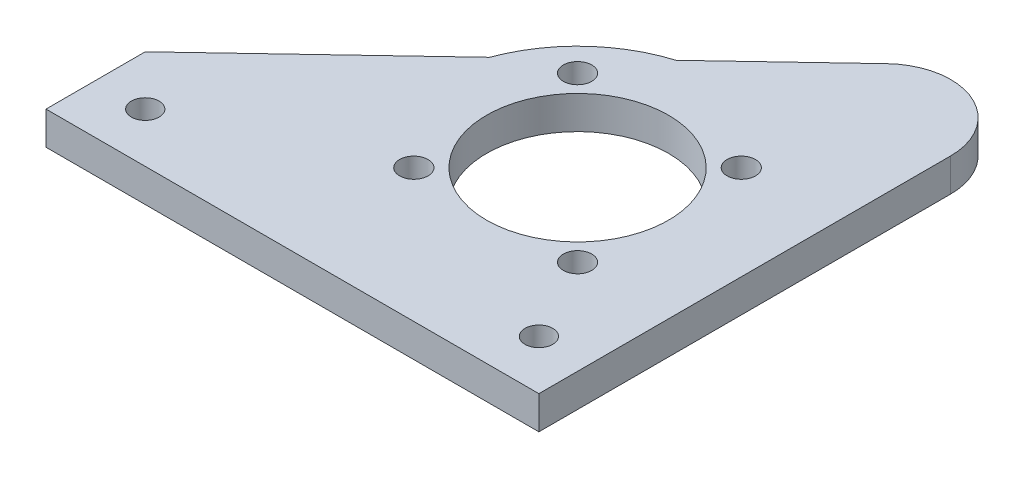
ISO-10303-21;
HEADER;
FILE_DESCRIPTION(('STEP AP214'),'2;1');
FILE_NAME('part.step','',(''),(''),'','','');
FILE_SCHEMA(('AUTOMOTIVE_DESIGN { 1 0 10303 214 1 1 1 1 }'));
ENDSEC;
DATA;
#1=APPLICATION_CONTEXT('core data for automotive mechanical design processes');
#2=APPLICATION_PROTOCOL_DEFINITION('international standard','automotive_design',2000,#1);
#3=PRODUCT_CONTEXT('',#1,'mechanical');
#4=PRODUCT('Part','Part','',(#3));
#5=PRODUCT_RELATED_PRODUCT_CATEGORY('part','',(#4));
#6=PRODUCT_DEFINITION_FORMATION('','',#4);
#7=PRODUCT_DEFINITION_CONTEXT('part definition',#1,'design');
#8=PRODUCT_DEFINITION('design','',#6,#7);
#9=PRODUCT_DEFINITION_SHAPE('','',#8);
#10=(LENGTH_UNIT() NAMED_UNIT(*) SI_UNIT(.MILLI.,.METRE.));
#11=(NAMED_UNIT(*) PLANE_ANGLE_UNIT() SI_UNIT($,.RADIAN.));
#12=(NAMED_UNIT(*) SI_UNIT($,.STERADIAN.) SOLID_ANGLE_UNIT());
#13=UNCERTAINTY_MEASURE_WITH_UNIT(LENGTH_MEASURE(1.E-05),#10,'distance_accuracy_value','');
#14=(GEOMETRIC_REPRESENTATION_CONTEXT(3) GLOBAL_UNCERTAINTY_ASSIGNED_CONTEXT((#13)) GLOBAL_UNIT_ASSIGNED_CONTEXT((#10,
#11,#12)) REPRESENTATION_CONTEXT('',''));
#15=CARTESIAN_POINT('',(0.,0.,0.));
#16=DIRECTION('',(0.,0.,1.));
#17=DIRECTION('',(1.,0.,0.));
#18=AXIS2_PLACEMENT_3D('',#15,#16,#17);
#19=CARTESIAN_POINT('',(-49.7879722436392,5.,-52.63299922899));
#20=DIRECTION('',(0.687199853876083,0.,0.726468416954716));
#21=DIRECTION('',(0.726468416954716,0.,-0.687199853876083));
#22=AXIS2_PLACEMENT_3D('',#19,#20,#21);
#23=PLANE('',#22);
#24=DIRECTION('',(-0.726468416954716,0.,0.687199853876083));
#25=VECTOR('',#24,1.);
#26=CARTESIAN_POINT('',(-49.7879722436392,5.,-52.63299922899));
#27=LINE('',#26,#25);
#28=CARTESIAN_POINT('',(-39.8719985387608,5.,-62.0129743552263));
#29=VERTEX_POINT('',#28);
#30=CARTESIAN_POINT('',(-56.2636866193653,5.,-46.507323468168));
#31=VERTEX_POINT('',#30);
#32=EDGE_CURVE('E172',#29,#31,#27,.T.);
#33=ORIENTED_EDGE('',*,*,#32,.F.);
#34=DIRECTION('',(0.,1.,0.));
#35=VECTOR('',#34,1.);
#36=CARTESIAN_POINT('',(-39.8719985387608,5.,-62.0129743552263));
#37=LINE('',#36,#35);
#38=CARTESIAN_POINT('',(-39.8719985387608,0.,-62.0129743552263));
#39=VERTEX_POINT('',#38);
#40=EDGE_CURVE('E44',#29,#39,#37,.F.);
#41=ORIENTED_EDGE('',*,*,#40,.T.);
#42=DIRECTION('',(-0.726468416954716,0.,0.687199853876083));
#43=VECTOR('',#42,1.);
#44=CARTESIAN_POINT('',(-49.7879722436392,0.,-52.63299922899));
#45=LINE('',#44,#43);
#46=CARTESIAN_POINT('',(-56.2636866193653,0.,-46.507323468168));
#47=VERTEX_POINT('',#46);
#48=EDGE_CURVE('E145',#39,#47,#45,.T.);
#49=ORIENTED_EDGE('',*,*,#48,.T.);
#50=DIRECTION('',(0.,-1.,0.));
#51=VECTOR('',#50,1.);
#52=CARTESIAN_POINT('',(-56.2636866193653,5.,-46.507323468168));
#53=LINE('',#52,#51);
#54=EDGE_CURVE('E161',#31,#47,#53,.T.);
#55=ORIENTED_EDGE('',*,*,#54,.F.);
#56=EDGE_LOOP('',(#33,#41,#49,#55));
#57=FACE_BOUND('',#56,.T.);
#58=ADVANCED_FACE('F36',(#57),#23,.F.);
#59=CARTESIAN_POINT('',(-49.6542208893995,5.,-25.));
#60=DIRECTION('',(0.,-1.,0.));
#61=DIRECTION('',(0.,0.,-1.));
#62=AXIS2_PLACEMENT_3D('',#59,#60,#61);
#63=CYLINDRICAL_SURFACE('',#62,22.5);
#64=CARTESIAN_POINT('',(-49.6542208893995,0.,-25.));
#65=DIRECTION('',(0.,1.,0.));
#66=DIRECTION('',(0.,0.,1.));
#67=AXIS2_PLACEMENT_3D('',#64,#65,#66);
#68=CIRCLE('',#67,22.5);
#69=CARTESIAN_POINT('',(-70.7614702022137,0.,-32.7932038627708));
#70=VERTEX_POINT('',#69);
#71=EDGE_CURVE('E147',#47,#70,#68,.T.);
#72=ORIENTED_EDGE('',*,*,#71,.T.);
#73=DIRECTION('',(0.,-1.,0.));
#74=VECTOR('',#73,1.);
#75=CARTESIAN_POINT('',(-70.7614702022137,5.,-32.7932038627708));
#76=LINE('',#75,#74);
#77=CARTESIAN_POINT('',(-70.7614702022137,5.,-32.7932038627708));
#78=VERTEX_POINT('',#77);
#79=EDGE_CURVE('E158',#78,#70,#76,.T.);
#80=ORIENTED_EDGE('',*,*,#79,.F.);
#81=CARTESIAN_POINT('',(-49.6542208893995,5.,-25.));
#82=DIRECTION('',(0.,1.,0.));
#83=DIRECTION('',(0.,0.,1.));
#84=AXIS2_PLACEMENT_3D('',#81,#82,#83);
#85=CIRCLE('',#84,22.5);
#86=EDGE_CURVE('E171',#31,#78,#85,.T.);
#87=ORIENTED_EDGE('',*,*,#86,.F.);
#88=ORIENTED_EDGE('',*,*,#54,.T.);
#89=EDGE_LOOP('',(#72,#80,#87,#88));
#90=FACE_BOUND('',#89,.T.);
#91=ADVANCED_FACE('F168',(#90),#63,.T.);
#92=CARTESIAN_POINT('',(-49.7879722436392,5.,-52.63299922899));
#93=DIRECTION('',(0.687199853876083,0.,0.726468416954716));
#94=DIRECTION('',(0.726468416954716,0.,-0.687199853876083));
#95=AXIS2_PLACEMENT_3D('',#92,#93,#94);
#96=PLANE('',#95);
#97=DIRECTION('',(-0.726468416954716,0.,0.687199853876083));
#98=VECTOR('',#97,1.);
#99=CARTESIAN_POINT('',(-49.7879722436392,0.,-52.63299922899));
#100=LINE('',#99,#98);
#101=CARTESIAN_POINT('',(-97.5,0.,-7.49999999999999));
#102=VERTEX_POINT('',#101);
#103=EDGE_CURVE('E149',#70,#102,#100,.T.);
#104=ORIENTED_EDGE('',*,*,#103,.T.);
#105=DIRECTION('',(0.,-1.,0.));
#106=VECTOR('',#105,1.);
#107=CARTESIAN_POINT('',(-97.5,5.,-7.49999999999999));
#108=LINE('',#107,#106);
#109=CARTESIAN_POINT('',(-97.5,5.,-7.49999999999999));
#110=VERTEX_POINT('',#109);
#111=EDGE_CURVE('E118',#110,#102,#108,.T.);
#112=ORIENTED_EDGE('',*,*,#111,.F.);
#113=DIRECTION('',(-0.726468416954716,0.,0.687199853876083));
#114=VECTOR('',#113,1.);
#115=CARTESIAN_POINT('',(-49.7879722436392,5.,-52.63299922899));
#116=LINE('',#115,#114);
#117=EDGE_CURVE('E120',#78,#110,#116,.T.);
#118=ORIENTED_EDGE('',*,*,#117,.F.);
#119=ORIENTED_EDGE('',*,*,#79,.T.);
#120=EDGE_LOOP('',(#104,#112,#118,#119));
#121=FACE_BOUND('',#120,.T.);
#122=ADVANCED_FACE('F180',(#121),#96,.F.);
#123=CARTESIAN_POINT('',(-97.5,5.,0.));
#124=DIRECTION('',(1.,0.,0.));
#125=DIRECTION('',(0.,0.,-1.));
#126=AXIS2_PLACEMENT_3D('',#123,#124,#125);
#127=PLANE('',#126);
#128=DIRECTION('',(0.,0.,1.));
#129=VECTOR('',#128,1.);
#130=CARTESIAN_POINT('',(-97.5,0.,0.));
#131=LINE('',#130,#129);
#132=CARTESIAN_POINT('',(-97.5,0.,7.5));
#133=VERTEX_POINT('',#132);
#134=EDGE_CURVE('E151',#102,#133,#131,.T.);
#135=ORIENTED_EDGE('',*,*,#134,.T.);
#136=DIRECTION('',(0.,-1.,0.));
#137=VECTOR('',#136,1.);
#138=CARTESIAN_POINT('',(-97.5,5.,7.5));
#139=LINE('',#138,#137);
#140=CARTESIAN_POINT('',(-97.5,5.,7.5));
#141=VERTEX_POINT('',#140);
#142=EDGE_CURVE('E116',#141,#133,#139,.T.);
#143=ORIENTED_EDGE('',*,*,#142,.F.);
#144=DIRECTION('',(0.,0.,1.));
#145=VECTOR('',#144,1.);
#146=CARTESIAN_POINT('',(-97.5,5.,0.));
#147=LINE('',#146,#145);
#148=EDGE_CURVE('E114',#110,#141,#147,.T.);
#149=ORIENTED_EDGE('',*,*,#148,.F.);
#150=ORIENTED_EDGE('',*,*,#111,.T.);
#151=EDGE_LOOP('',(#135,#143,#149,#150));
#152=FACE_BOUND('',#151,.T.);
#153=ADVANCED_FACE('F183',(#152),#127,.F.);
#154=CARTESIAN_POINT('',(0.,5.,7.5));
#155=DIRECTION('',(0.,0.,1.));
#156=DIRECTION('',(1.,0.,0.));
#157=AXIS2_PLACEMENT_3D('',#154,#155,#156);
#158=PLANE('',#157);
#159=DIRECTION('',(0.,1.,0.));
#160=VECTOR('',#159,1.);
#161=CARTESIAN_POINT('',(-23.,-106.255588088345,7.5));
#162=LINE('',#161,#160);
#163=CARTESIAN_POINT('',(-23.,0.,7.5));
#164=VERTEX_POINT('',#163);
#165=CARTESIAN_POINT('',(-23.,5.,7.5));
#166=VERTEX_POINT('',#165);
#167=EDGE_CURVE('E96',#164,#166,#162,.T.);
#168=ORIENTED_EDGE('',*,*,#167,.T.);
#169=DIRECTION('',(-1.,0.,0.));
#170=VECTOR('',#169,1.);
#171=CARTESIAN_POINT('',(0.,5.,7.5));
#172=LINE('',#171,#170);
#173=EDGE_CURVE('E106',#166,#141,#172,.T.);
#174=ORIENTED_EDGE('',*,*,#173,.T.);
#175=ORIENTED_EDGE('',*,*,#142,.T.);
#176=DIRECTION('',(-1.,0.,0.));
#177=VECTOR('',#176,1.);
#178=CARTESIAN_POINT('',(0.,0.,7.5));
#179=LINE('',#178,#177);
#180=EDGE_CURVE('E108',#164,#133,#179,.T.);
#181=ORIENTED_EDGE('',*,*,#180,.F.);
#182=EDGE_LOOP('',(#168,#174,#175,#181));
#183=FACE_BOUND('',#182,.T.);
#184=ADVANCED_FACE('F104',(#183),#158,.T.);
#185=CARTESIAN_POINT('',(-90.,5.,0.));
#186=DIRECTION('',(0.,-1.,0.));
#187=DIRECTION('',(0.,0.,-1.));
#188=AXIS2_PLACEMENT_3D('',#185,#186,#187);
#189=CYLINDRICAL_SURFACE('',#188,2.1);
#190=CARTESIAN_POINT('',(-90.,5.,0.));
#191=DIRECTION('',(0.,1.,0.));
#192=DIRECTION('',(0.,0.,1.));
#193=AXIS2_PLACEMENT_3D('',#190,#191,#192);
#194=CIRCLE('',#193,2.1);
#195=CARTESIAN_POINT('',(-90.,5.,2.10000000000002));
#196=VERTEX_POINT('',#195);
#197=EDGE_CURVE('E282',#196,#196,#194,.T.);
#198=ORIENTED_EDGE('',*,*,#197,.T.);
#199=EDGE_LOOP('',(#198));
#200=FACE_BOUND('',#199,.T.);
#201=CARTESIAN_POINT('',(-90.,0.,0.));
#202=DIRECTION('',(0.,1.,0.));
#203=DIRECTION('',(0.,0.,1.));
#204=AXIS2_PLACEMENT_3D('',#201,#202,#203);
#205=CIRCLE('',#204,2.1);
#206=CARTESIAN_POINT('',(-90.,0.,2.10000000000002));
#207=VERTEX_POINT('',#206);
#208=EDGE_CURVE('E142',#207,#207,#205,.T.);
#209=ORIENTED_EDGE('',*,*,#208,.F.);
#210=EDGE_LOOP('',(#209));
#211=FACE_BOUND('',#210,.T.);
#212=ADVANCED_FACE('F190',(#200,#211),#189,.F.);
#213=CARTESIAN_POINT('',(-62.0285895601641,5.,-37.3743686707646));
#214=DIRECTION('',(0.,-1.,0.));
#215=DIRECTION('',(0.,0.,-1.));
#216=AXIS2_PLACEMENT_3D('',#213,#214,#215);
#217=CYLINDRICAL_SURFACE('',#216,2.15);
#218=CARTESIAN_POINT('',(-62.0285895601641,5.,-37.3743686707646));
#219=DIRECTION('',(0.,1.,0.));
#220=DIRECTION('',(0.,0.,1.));
#221=AXIS2_PLACEMENT_3D('',#218,#219,#220);
#222=CIRCLE('',#221,2.15);
#223=CARTESIAN_POINT('',(-62.0285895601641,5.,-35.2243686707646));
#224=VERTEX_POINT('',#223);
#225=EDGE_CURVE('E279',#224,#224,#222,.T.);
#226=ORIENTED_EDGE('',*,*,#225,.T.);
#227=EDGE_LOOP('',(#226));
#228=FACE_BOUND('',#227,.T.);
#229=CARTESIAN_POINT('',(-62.0285895601641,0.,-37.3743686707646));
#230=DIRECTION('',(0.,1.,0.));
#231=DIRECTION('',(0.,0.,1.));
#232=AXIS2_PLACEMENT_3D('',#229,#230,#231);
#233=CIRCLE('',#232,2.15);
#234=CARTESIAN_POINT('',(-62.0285895601641,0.,-35.2243686707646));
#235=VERTEX_POINT('',#234);
#236=EDGE_CURVE('E139',#235,#235,#233,.T.);
#237=ORIENTED_EDGE('',*,*,#236,.F.);
#238=EDGE_LOOP('',(#237));
#239=FACE_BOUND('',#238,.T.);
#240=ADVANCED_FACE('F202',(#228,#239),#217,.F.);
#241=CARTESIAN_POINT('',(-62.0285895601641,5.,-12.6256313292354));
#242=DIRECTION('',(0.,-1.,0.));
#243=DIRECTION('',(0.,0.,-1.));
#244=AXIS2_PLACEMENT_3D('',#241,#242,#243);
#245=CYLINDRICAL_SURFACE('',#244,2.15000000000002);
#246=CARTESIAN_POINT('',(-62.0285895601641,5.,-12.6256313292354));
#247=DIRECTION('',(0.,1.,0.));
#248=DIRECTION('',(0.,0.,1.));
#249=AXIS2_PLACEMENT_3D('',#246,#247,#248);
#250=CIRCLE('',#249,2.15000000000002);
#251=CARTESIAN_POINT('',(-62.0285895601641,5.,-10.4756313292354));
#252=VERTEX_POINT('',#251);
#253=EDGE_CURVE('E276',#252,#252,#250,.T.);
#254=ORIENTED_EDGE('',*,*,#253,.T.);
#255=EDGE_LOOP('',(#254));
#256=FACE_BOUND('',#255,.T.);
#257=CARTESIAN_POINT('',(-62.0285895601641,0.,-12.6256313292354));
#258=DIRECTION('',(0.,1.,0.));
#259=DIRECTION('',(0.,0.,1.));
#260=AXIS2_PLACEMENT_3D('',#257,#258,#259);
#261=CIRCLE('',#260,2.15000000000002);
#262=CARTESIAN_POINT('',(-62.0285895601641,0.,-10.4756313292354));
#263=VERTEX_POINT('',#262);
#264=EDGE_CURVE('E136',#263,#263,#261,.T.);
#265=ORIENTED_EDGE('',*,*,#264,.F.);
#266=EDGE_LOOP('',(#265));
#267=FACE_BOUND('',#266,.T.);
#268=ADVANCED_FACE('F206',(#256,#267),#245,.F.);
#269=CARTESIAN_POINT('',(-37.279852218635,5.,-12.6256313292354));
#270=DIRECTION('',(0.,-1.,0.));
#271=DIRECTION('',(0.,0.,-1.));
#272=AXIS2_PLACEMENT_3D('',#269,#270,#271);
#273=CYLINDRICAL_SURFACE('',#272,2.15);
#274=CARTESIAN_POINT('',(-37.279852218635,5.,-12.6256313292354));
#275=DIRECTION('',(0.,1.,0.));
#276=DIRECTION('',(0.,0.,1.));
#277=AXIS2_PLACEMENT_3D('',#274,#275,#276);
#278=CIRCLE('',#277,2.15);
#279=CARTESIAN_POINT('',(-37.279852218635,5.,-10.4756313292354));
#280=VERTEX_POINT('',#279);
#281=EDGE_CURVE('E273',#280,#280,#278,.T.);
#282=ORIENTED_EDGE('',*,*,#281,.T.);
#283=EDGE_LOOP('',(#282));
#284=FACE_BOUND('',#283,.T.);
#285=CARTESIAN_POINT('',(-37.279852218635,0.,-12.6256313292354));
#286=DIRECTION('',(0.,1.,0.));
#287=DIRECTION('',(0.,0.,1.));
#288=AXIS2_PLACEMENT_3D('',#285,#286,#287);
#289=CIRCLE('',#288,2.15);
#290=CARTESIAN_POINT('',(-37.279852218635,0.,-10.4756313292354));
#291=VERTEX_POINT('',#290);
#292=EDGE_CURVE('E133',#291,#291,#289,.T.);
#293=ORIENTED_EDGE('',*,*,#292,.F.);
#294=EDGE_LOOP('',(#293));
#295=FACE_BOUND('',#294,.T.);
#296=ADVANCED_FACE('F210',(#284,#295),#273,.F.);
#297=CARTESIAN_POINT('',(-37.279852218635,5.,-37.3743686707646));
#298=DIRECTION('',(0.,-1.,0.));
#299=DIRECTION('',(0.,0.,-1.));
#300=AXIS2_PLACEMENT_3D('',#297,#298,#299);
#301=CYLINDRICAL_SURFACE('',#300,2.15);
#302=CARTESIAN_POINT('',(-37.279852218635,5.,-37.3743686707646));
#303=DIRECTION('',(0.,1.,0.));
#304=DIRECTION('',(0.,0.,1.));
#305=AXIS2_PLACEMENT_3D('',#302,#303,#304);
#306=CIRCLE('',#305,2.15);
#307=CARTESIAN_POINT('',(-37.279852218635,5.,-35.2243686707646));
#308=VERTEX_POINT('',#307);
#309=EDGE_CURVE('E270',#308,#308,#306,.T.);
#310=ORIENTED_EDGE('',*,*,#309,.T.);
#311=EDGE_LOOP('',(#310));
#312=FACE_BOUND('',#311,.T.);
#313=CARTESIAN_POINT('',(-37.279852218635,0.,-37.3743686707646));
#314=DIRECTION('',(0.,1.,0.));
#315=DIRECTION('',(0.,0.,1.));
#316=AXIS2_PLACEMENT_3D('',#313,#314,#315);
#317=CIRCLE('',#316,2.15);
#318=CARTESIAN_POINT('',(-37.279852218635,0.,-35.2243686707646));
#319=VERTEX_POINT('',#318);
#320=EDGE_CURVE('E130',#319,#319,#317,.T.);
#321=ORIENTED_EDGE('',*,*,#320,.F.);
#322=EDGE_LOOP('',(#321));
#323=FACE_BOUND('',#322,.T.);
#324=ADVANCED_FACE('F214',(#312,#323),#301,.F.);
#325=CARTESIAN_POINT('',(-49.6542208893995,5.,-25.));
#326=DIRECTION('',(0.,-1.,0.));
#327=DIRECTION('',(0.,0.,-1.));
#328=AXIS2_PLACEMENT_3D('',#325,#326,#327);
#329=CYLINDRICAL_SURFACE('',#328,13.75);
#330=CARTESIAN_POINT('',(-49.6542208893995,5.,-25.));
#331=DIRECTION('',(0.,1.,0.));
#332=DIRECTION('',(0.,0.,1.));
#333=AXIS2_PLACEMENT_3D('',#330,#331,#332);
#334=CIRCLE('',#333,13.75);
#335=CARTESIAN_POINT('',(-49.6542208893995,5.,-11.25));
#336=VERTEX_POINT('',#335);
#337=EDGE_CURVE('E267',#336,#336,#334,.T.);
#338=ORIENTED_EDGE('',*,*,#337,.T.);
#339=EDGE_LOOP('',(#338));
#340=FACE_BOUND('',#339,.T.);
#341=CARTESIAN_POINT('',(-49.6542208893995,0.,-25.));
#342=DIRECTION('',(0.,1.,0.));
#343=DIRECTION('',(0.,0.,1.));
#344=AXIS2_PLACEMENT_3D('',#341,#342,#343);
#345=CIRCLE('',#344,13.75);
#346=CARTESIAN_POINT('',(-49.6542208893995,0.,-11.25));
#347=VERTEX_POINT('',#346);
#348=EDGE_CURVE('E127',#347,#347,#345,.T.);
#349=ORIENTED_EDGE('',*,*,#348,.F.);
#350=EDGE_LOOP('',(#349));
#351=FACE_BOUND('',#350,.T.);
#352=ADVANCED_FACE('F218',(#340,#351),#329,.F.);
#353=CARTESIAN_POINT('',(-30.5,5.,0.));
#354=DIRECTION('',(0.,-1.,0.));
#355=DIRECTION('',(0.,0.,-1.));
#356=AXIS2_PLACEMENT_3D('',#353,#354,#355);
#357=CYLINDRICAL_SURFACE('',#356,2.1);
#358=CARTESIAN_POINT('',(-30.5,5.,0.));
#359=DIRECTION('',(0.,1.,0.));
#360=DIRECTION('',(0.,0.,1.));
#361=AXIS2_PLACEMENT_3D('',#358,#359,#360);
#362=CIRCLE('',#361,2.1);
#363=CARTESIAN_POINT('',(-30.5,5.,2.1));
#364=VERTEX_POINT('',#363);
#365=EDGE_CURVE('E154',#364,#364,#362,.T.);
#366=ORIENTED_EDGE('',*,*,#365,.T.);
#367=EDGE_LOOP('',(#366));
#368=FACE_BOUND('',#367,.T.);
#369=CARTESIAN_POINT('',(-30.5,0.,0.));
#370=DIRECTION('',(0.,1.,0.));
#371=DIRECTION('',(0.,0.,1.));
#372=AXIS2_PLACEMENT_3D('',#369,#370,#371);
#373=CIRCLE('',#372,2.1);
#374=CARTESIAN_POINT('',(-30.5,0.,2.1));
#375=VERTEX_POINT('',#374);
#376=EDGE_CURVE('E124',#375,#375,#373,.T.);
#377=ORIENTED_EDGE('',*,*,#376,.F.);
#378=EDGE_LOOP('',(#377));
#379=FACE_BOUND('',#378,.T.);
#380=ADVANCED_FACE('F221',(#368,#379),#357,.F.);
#381=CARTESIAN_POINT('',(0.,5.,0.));
#382=DIRECTION('',(0.,1.,0.));
#383=DIRECTION('',(0.,0.,1.));
#384=AXIS2_PLACEMENT_3D('',#381,#382,#383);
#385=PLANE('',#384);
#386=DIRECTION('',(0.,0.,1.));
#387=VECTOR('',#386,1.);
#388=CARTESIAN_POINT('',(-23.,5.,7.5));
#389=LINE('',#388,#387);
#390=CARTESIAN_POINT('',(-23.,5.,-54.7482901856791));
#391=VERTEX_POINT('',#390);
#392=EDGE_CURVE('E92',#391,#166,#389,.T.);
#393=ORIENTED_EDGE('',*,*,#392,.F.);
#394=CARTESIAN_POINT('',(-33.,5.,-54.7482901856791));
#395=DIRECTION('',(0.,1.,0.));
#396=DIRECTION('',(0.,0.,1.));
#397=AXIS2_PLACEMENT_3D('',#394,#395,#396);
#398=CIRCLE('',#397,10.);
#399=EDGE_CURVE('E58',#391,#29,#398,.T.);
#400=ORIENTED_EDGE('',*,*,#399,.T.);
#401=ORIENTED_EDGE('',*,*,#32,.T.);
#402=ORIENTED_EDGE('',*,*,#86,.T.);
#403=ORIENTED_EDGE('',*,*,#117,.T.);
#404=ORIENTED_EDGE('',*,*,#148,.T.);
#405=ORIENTED_EDGE('',*,*,#173,.F.);
#406=EDGE_LOOP('',(#393,#400,#401,#402,#403,#404,#405));
#407=FACE_BOUND('',#406,.T.);
#408=ORIENTED_EDGE('',*,*,#365,.F.);
#409=EDGE_LOOP('',(#408));
#410=FACE_BOUND('',#409,.T.);
#411=ORIENTED_EDGE('',*,*,#337,.F.);
#412=EDGE_LOOP('',(#411));
#413=FACE_BOUND('',#412,.T.);
#414=ORIENTED_EDGE('',*,*,#309,.F.);
#415=EDGE_LOOP('',(#414));
#416=FACE_BOUND('',#415,.T.);
#417=ORIENTED_EDGE('',*,*,#281,.F.);
#418=EDGE_LOOP('',(#417));
#419=FACE_BOUND('',#418,.T.);
#420=ORIENTED_EDGE('',*,*,#253,.F.);
#421=EDGE_LOOP('',(#420));
#422=FACE_BOUND('',#421,.T.);
#423=ORIENTED_EDGE('',*,*,#225,.F.);
#424=EDGE_LOOP('',(#423));
#425=FACE_BOUND('',#424,.T.);
#426=ORIENTED_EDGE('',*,*,#197,.F.);
#427=EDGE_LOOP('',(#426));
#428=FACE_BOUND('',#427,.T.);
#429=ADVANCED_FACE('F111',(#407,#410,#413,#416,#419,#422,#425,#428),#385,.T.);
#430=CARTESIAN_POINT('',(0.,0.,0.));
#431=DIRECTION('',(0.,1.,0.));
#432=DIRECTION('',(0.,0.,1.));
#433=AXIS2_PLACEMENT_3D('',#430,#431,#432);
#434=PLANE('',#433);
#435=ORIENTED_EDGE('',*,*,#376,.T.);
#436=EDGE_LOOP('',(#435));
#437=FACE_BOUND('',#436,.T.);
#438=ORIENTED_EDGE('',*,*,#348,.T.);
#439=EDGE_LOOP('',(#438));
#440=FACE_BOUND('',#439,.T.);
#441=ORIENTED_EDGE('',*,*,#320,.T.);
#442=EDGE_LOOP('',(#441));
#443=FACE_BOUND('',#442,.T.);
#444=ORIENTED_EDGE('',*,*,#292,.T.);
#445=EDGE_LOOP('',(#444));
#446=FACE_BOUND('',#445,.T.);
#447=ORIENTED_EDGE('',*,*,#264,.T.);
#448=EDGE_LOOP('',(#447));
#449=FACE_BOUND('',#448,.T.);
#450=ORIENTED_EDGE('',*,*,#236,.T.);
#451=EDGE_LOOP('',(#450));
#452=FACE_BOUND('',#451,.T.);
#453=ORIENTED_EDGE('',*,*,#208,.T.);
#454=EDGE_LOOP('',(#453));
#455=FACE_BOUND('',#454,.T.);
#456=ORIENTED_EDGE('',*,*,#48,.F.);
#457=CARTESIAN_POINT('',(-33.,0.,-54.7482901856791));
#458=DIRECTION('',(0.,1.,0.));
#459=DIRECTION('',(0.,0.,1.));
#460=AXIS2_PLACEMENT_3D('',#457,#458,#459);
#461=CIRCLE('',#460,10.);
#462=CARTESIAN_POINT('',(-23.,0.,-54.7482901856791));
#463=VERTEX_POINT('',#462);
#464=EDGE_CURVE('E11',#39,#463,#461,.F.);
#465=ORIENTED_EDGE('',*,*,#464,.T.);
#466=DIRECTION('',(0.,0.,-1.));
#467=VECTOR('',#466,1.);
#468=CARTESIAN_POINT('',(-23.,0.,7.5));
#469=LINE('',#468,#467);
#470=EDGE_CURVE('E109',#164,#463,#469,.T.);
#471=ORIENTED_EDGE('',*,*,#470,.F.);
#472=ORIENTED_EDGE('',*,*,#180,.T.);
#473=ORIENTED_EDGE('',*,*,#134,.F.);
#474=ORIENTED_EDGE('',*,*,#103,.F.);
#475=ORIENTED_EDGE('',*,*,#71,.F.);
#476=EDGE_LOOP('',(#456,#465,#471,#472,#473,#474,#475));
#477=FACE_BOUND('',#476,.T.);
#478=ADVANCED_FACE('F176',(#437,#440,#443,#446,#449,#452,#455,#477),#434,.F.);
#479=CARTESIAN_POINT('',(-23.,-106.255588088345,7.5));
#480=DIRECTION('',(-1.,0.,0.));
#481=DIRECTION('',(0.,0.,1.));
#482=AXIS2_PLACEMENT_3D('',#479,#480,#481);
#483=PLANE('',#482);
#484=ORIENTED_EDGE('',*,*,#470,.T.);
#485=DIRECTION('',(0.,1.,0.));
#486=VECTOR('',#485,1.);
#487=CARTESIAN_POINT('',(-23.,-106.255588088345,-54.7482901856791));
#488=LINE('',#487,#486);
#489=EDGE_CURVE('E99',#463,#391,#488,.T.);
#490=ORIENTED_EDGE('',*,*,#489,.T.);
#491=ORIENTED_EDGE('',*,*,#392,.T.);
#492=ORIENTED_EDGE('',*,*,#167,.F.);
#493=EDGE_LOOP('',(#484,#490,#491,#492));
#494=FACE_BOUND('',#493,.T.);
#495=ADVANCED_FACE('F95',(#494),#483,.F.);
#496=CARTESIAN_POINT('',(-33.,-106.255588088345,-54.7482901856791));
#497=DIRECTION('',(0.,1.,0.));
#498=DIRECTION('',(0.,0.,1.));
#499=AXIS2_PLACEMENT_3D('',#496,#497,#498);
#500=CYLINDRICAL_SURFACE('',#499,10.);
#501=ORIENTED_EDGE('',*,*,#464,.F.);
#502=ORIENTED_EDGE('',*,*,#40,.F.);
#503=ORIENTED_EDGE('',*,*,#399,.F.);
#504=ORIENTED_EDGE('',*,*,#489,.F.);
#505=EDGE_LOOP('',(#501,#502,#503,#504));
#506=FACE_BOUND('',#505,.T.);
#507=ADVANCED_FACE('F38',(#506),#500,.T.);
#508=CLOSED_SHELL('',(#58,#91,#122,#153,#184,#212,#240,#268,#296,#324,#352,#380,#429,#478,#495,#507));
#509=MANIFOLD_SOLID_BREP('B2',#508);
#510=ADVANCED_BREP_SHAPE_REPRESENTATION('',(#18,#509),#14);
#511=SHAPE_DEFINITION_REPRESENTATION(#9,#510);
ENDSEC;
END-ISO-10303-21;
